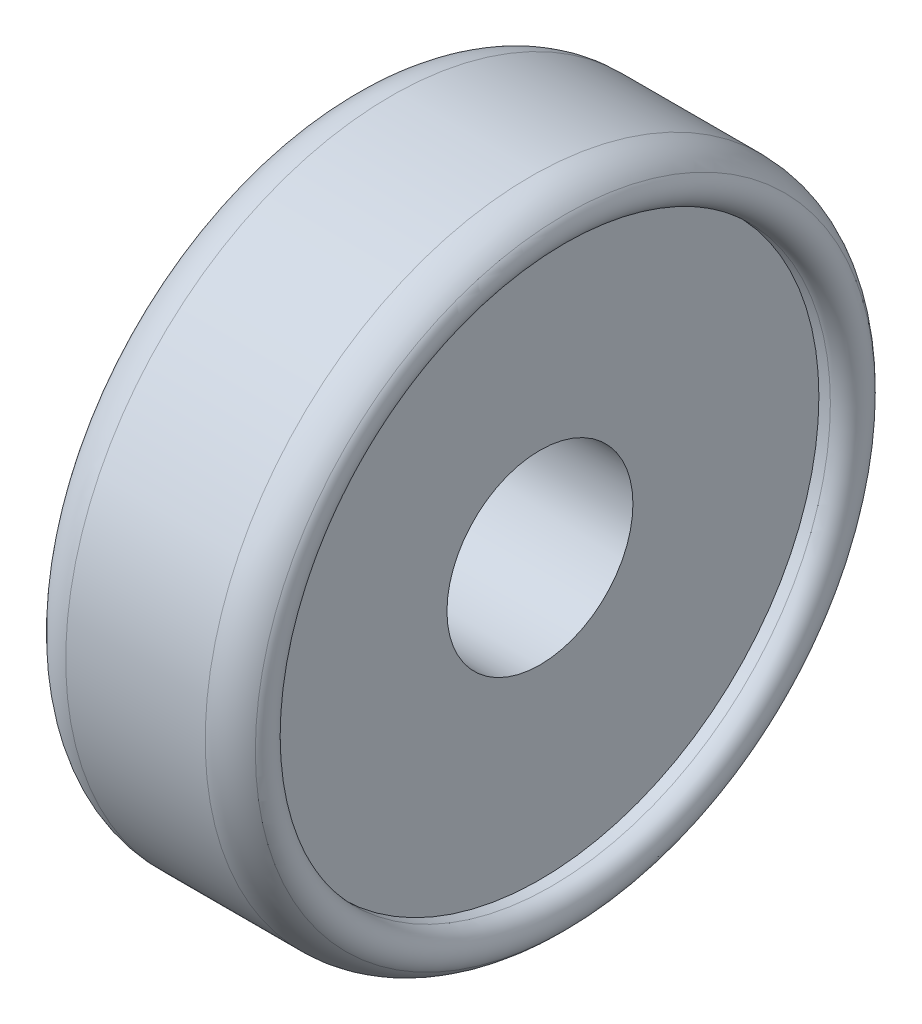
ISO-10303-21;
HEADER;
FILE_DESCRIPTION(('STEP AP214'),'2;1');
FILE_NAME('part.step','',(''),(''),'','','');
FILE_SCHEMA(('AUTOMOTIVE_DESIGN { 1 0 10303 214 1 1 1 1 }'));
ENDSEC;
DATA;
#1=APPLICATION_CONTEXT('core data for automotive mechanical design processes');
#2=APPLICATION_PROTOCOL_DEFINITION('international standard','automotive_design',2000,#1);
#3=PRODUCT_CONTEXT('',#1,'mechanical');
#4=PRODUCT('Part','Part','',(#3));
#5=PRODUCT_RELATED_PRODUCT_CATEGORY('part','',(#4));
#6=PRODUCT_DEFINITION_FORMATION('','',#4);
#7=PRODUCT_DEFINITION_CONTEXT('part definition',#1,'design');
#8=PRODUCT_DEFINITION('design','',#6,#7);
#9=PRODUCT_DEFINITION_SHAPE('','',#8);
#10=(LENGTH_UNIT() NAMED_UNIT(*) SI_UNIT(.MILLI.,.METRE.));
#11=(NAMED_UNIT(*) PLANE_ANGLE_UNIT() SI_UNIT($,.RADIAN.));
#12=(NAMED_UNIT(*) SI_UNIT($,.STERADIAN.) SOLID_ANGLE_UNIT());
#13=UNCERTAINTY_MEASURE_WITH_UNIT(LENGTH_MEASURE(1.E-05),#10,'distance_accuracy_value','');
#14=(GEOMETRIC_REPRESENTATION_CONTEXT(3) GLOBAL_UNCERTAINTY_ASSIGNED_CONTEXT((#13)) GLOBAL_UNIT_ASSIGNED_CONTEXT((#10,
#11,#12)) REPRESENTATION_CONTEXT('',''));
#15=CARTESIAN_POINT('',(0.,0.,0.));
#16=DIRECTION('',(0.,0.,1.));
#17=DIRECTION('',(1.,0.,0.));
#18=AXIS2_PLACEMENT_3D('',#15,#16,#17);
#19=CARTESIAN_POINT('',(125.,0.,0.));
#20=DIRECTION('',(-1.,0.,0.));
#21=DIRECTION('',(0.,0.,1.));
#22=AXIS2_PLACEMENT_3D('',#19,#20,#21);
#23=CYLINDRICAL_SURFACE('',#22,100.);
#24=CARTESIAN_POINT('',(-85.,0.,0.));
#25=DIRECTION('',(-1.,0.,0.));
#26=DIRECTION('',(0.,0.,1.));
#27=AXIS2_PLACEMENT_3D('',#24,#25,#26);
#28=CIRCLE('',#27,100.);
#29=CARTESIAN_POINT('',(-85.,0.,100.));
#30=VERTEX_POINT('',#29);
#31=EDGE_CURVE('E57',#30,#30,#28,.T.);
#32=ORIENTED_EDGE('',*,*,#31,.T.);
#33=EDGE_LOOP('',(#32));
#34=FACE_BOUND('',#33,.T.);
#35=CARTESIAN_POINT('',(85.,0.,0.));
#36=DIRECTION('',(1.,0.,0.));
#37=DIRECTION('',(0.,0.,-1.));
#38=AXIS2_PLACEMENT_3D('',#35,#36,#37);
#39=CIRCLE('',#38,100.);
#40=CARTESIAN_POINT('',(85.,0.,-100.));
#41=VERTEX_POINT('',#40);
#42=EDGE_CURVE('E52',#41,#41,#39,.T.);
#43=ORIENTED_EDGE('',*,*,#42,.T.);
#44=EDGE_LOOP('',(#43));
#45=FACE_BOUND('',#44,.T.);
#46=ADVANCED_FACE('F31',(#34,#45),#23,.F.);
#47=CARTESIAN_POINT('',(125.,0.,0.));
#48=DIRECTION('',(-1.,0.,0.));
#49=DIRECTION('',(0.,0.,1.));
#50=AXIS2_PLACEMENT_3D('',#47,#48,#49);
#51=CYLINDRICAL_SURFACE('',#50,350.);
#52=CARTESIAN_POINT('',(75.,0.,0.));
#53=DIRECTION('',(1.,0.,0.));
#54=DIRECTION('',(0.,0.,-1.));
#55=AXIS2_PLACEMENT_3D('',#52,#53,#54);
#56=CIRCLE('',#55,350.);
#57=CARTESIAN_POINT('',(75.,0.,-350.));
#58=VERTEX_POINT('',#57);
#59=EDGE_CURVE('E51',#58,#58,#56,.F.);
#60=ORIENTED_EDGE('',*,*,#59,.T.);
#61=EDGE_LOOP('',(#60));
#62=FACE_BOUND('',#61,.T.);
#63=CARTESIAN_POINT('',(-75.,0.,0.));
#64=DIRECTION('',(1.,0.,0.));
#65=DIRECTION('',(0.,0.,-1.));
#66=AXIS2_PLACEMENT_3D('',#63,#64,#65);
#67=CIRCLE('',#66,350.);
#68=CARTESIAN_POINT('',(-75.,0.,-350.));
#69=VERTEX_POINT('',#68);
#70=EDGE_CURVE('E60',#69,#69,#67,.T.);
#71=ORIENTED_EDGE('',*,*,#70,.T.);
#72=EDGE_LOOP('',(#71));
#73=FACE_BOUND('',#72,.T.);
#74=ADVANCED_FACE('F88',(#62,#73),#51,.T.);
#75=CARTESIAN_POINT('',(-75.,0.,0.));
#76=DIRECTION('',(1.,0.,0.));
#77=DIRECTION('',(0.,0.,-1.));
#78=AXIS2_PLACEMENT_3D('',#75,#76,#77);
#79=TOROIDAL_SURFACE('',#78,300.,50.);
#80=CARTESIAN_POINT('',(-112.267799624996,0.,0.));
#81=DIRECTION('',(1.,0.,0.));
#82=DIRECTION('',(0.,0.,-1.));
#83=AXIS2_PLACEMENT_3D('',#80,#81,#82);
#84=CIRCLE('',#83,333.333333333333);
#85=CARTESIAN_POINT('',(-112.267799624996,0.,-333.333333333333));
#86=VERTEX_POINT('',#85);
#87=EDGE_CURVE('E10',#86,#86,#84,.T.);
#88=ORIENTED_EDGE('',*,*,#87,.T.);
#89=EDGE_LOOP('',(#88));
#90=FACE_BOUND('',#89,.T.);
#91=ORIENTED_EDGE('',*,*,#70,.F.);
#92=EDGE_LOOP('',(#91));
#93=FACE_BOUND('',#92,.T.);
#94=ADVANCED_FACE('F94',(#90,#93),#79,.T.);
#95=CARTESIAN_POINT('',(75.,0.,0.));
#96=DIRECTION('',(1.,0.,0.));
#97=DIRECTION('',(0.,0.,-1.));
#98=AXIS2_PLACEMENT_3D('',#95,#96,#97);
#99=TOROIDAL_SURFACE('',#98,300.,50.);
#100=CARTESIAN_POINT('',(112.267799624996,0.,0.));
#101=DIRECTION('',(-1.,0.,0.));
#102=DIRECTION('',(0.,0.,1.));
#103=AXIS2_PLACEMENT_3D('',#100,#101,#102);
#104=CIRCLE('',#103,333.333333333332);
#105=CARTESIAN_POINT('',(112.267799624996,0.,333.333333333332));
#106=VERTEX_POINT('',#105);
#107=EDGE_CURVE('E42',#106,#106,#104,.T.);
#108=ORIENTED_EDGE('',*,*,#107,.T.);
#109=EDGE_LOOP('',(#108));
#110=FACE_BOUND('',#109,.T.);
#111=ORIENTED_EDGE('',*,*,#59,.F.);
#112=EDGE_LOOP('',(#111));
#113=FACE_BOUND('',#112,.T.);
#114=ADVANCED_FACE('F102',(#110,#113),#99,.T.);
#115=CARTESIAN_POINT('',(-85.,0.,0.));
#116=DIRECTION('',(-1.,0.,0.));
#117=DIRECTION('',(0.,0.,1.));
#118=AXIS2_PLACEMENT_3D('',#115,#116,#117);
#119=CYLINDRICAL_SURFACE('',#118,300.);
#120=CARTESIAN_POINT('',(-97.3606797749979,0.,0.));
#121=DIRECTION('',(1.,0.,0.));
#122=DIRECTION('',(0.,0.,-1.));
#123=AXIS2_PLACEMENT_3D('',#120,#121,#122);
#124=CIRCLE('',#123,300.);
#125=CARTESIAN_POINT('',(-97.3606797749979,0.,-300.));
#126=VERTEX_POINT('',#125);
#127=EDGE_CURVE('E38',#126,#126,#124,.F.);
#128=ORIENTED_EDGE('',*,*,#127,.T.);
#129=EDGE_LOOP('',(#128));
#130=FACE_BOUND('',#129,.T.);
#131=CARTESIAN_POINT('',(-85.,0.,0.));
#132=DIRECTION('',(-1.,0.,0.));
#133=DIRECTION('',(0.,0.,1.));
#134=AXIS2_PLACEMENT_3D('',#131,#132,#133);
#135=CIRCLE('',#134,300.);
#136=CARTESIAN_POINT('',(-85.,0.,300.));
#137=VERTEX_POINT('',#136);
#138=EDGE_CURVE('E55',#137,#137,#135,.T.);
#139=ORIENTED_EDGE('',*,*,#138,.F.);
#140=EDGE_LOOP('',(#139));
#141=FACE_BOUND('',#140,.T.);
#142=ADVANCED_FACE('F84',(#130,#141),#119,.F.);
#143=CARTESIAN_POINT('',(-85.,0.,0.));
#144=DIRECTION('',(-1.,0.,0.));
#145=DIRECTION('',(0.,0.,1.));
#146=AXIS2_PLACEMENT_3D('',#143,#144,#145);
#147=PLANE('',#146);
#148=ORIENTED_EDGE('',*,*,#31,.F.);
#149=EDGE_LOOP('',(#148));
#150=FACE_BOUND('',#149,.T.);
#151=ORIENTED_EDGE('',*,*,#138,.T.);
#152=EDGE_LOOP('',(#151));
#153=FACE_BOUND('',#152,.T.);
#154=ADVANCED_FACE('F74',(#150,#153),#147,.T.);
#155=CARTESIAN_POINT('',(85.,0.,0.));
#156=DIRECTION('',(1.,0.,0.));
#157=DIRECTION('',(0.,0.,-1.));
#158=AXIS2_PLACEMENT_3D('',#155,#156,#157);
#159=CYLINDRICAL_SURFACE('',#158,300.);
#160=CARTESIAN_POINT('',(97.3606797749979,0.,0.));
#161=DIRECTION('',(-1.,0.,0.));
#162=DIRECTION('',(0.,0.,1.));
#163=AXIS2_PLACEMENT_3D('',#160,#161,#162);
#164=CIRCLE('',#163,300.);
#165=CARTESIAN_POINT('',(97.3606797749979,0.,300.));
#166=VERTEX_POINT('',#165);
#167=EDGE_CURVE('E46',#166,#166,#164,.F.);
#168=ORIENTED_EDGE('',*,*,#167,.T.);
#169=EDGE_LOOP('',(#168));
#170=FACE_BOUND('',#169,.T.);
#171=CARTESIAN_POINT('',(85.,0.,0.));
#172=DIRECTION('',(1.,0.,0.));
#173=DIRECTION('',(0.,0.,-1.));
#174=AXIS2_PLACEMENT_3D('',#171,#172,#173);
#175=CIRCLE('',#174,300.);
#176=CARTESIAN_POINT('',(85.,0.,-300.));
#177=VERTEX_POINT('',#176);
#178=EDGE_CURVE('E56',#177,#177,#175,.T.);
#179=ORIENTED_EDGE('',*,*,#178,.F.);
#180=EDGE_LOOP('',(#179));
#181=FACE_BOUND('',#180,.T.);
#182=ADVANCED_FACE('F72',(#170,#181),#159,.F.);
#183=CARTESIAN_POINT('',(85.,0.,0.));
#184=DIRECTION('',(1.,0.,0.));
#185=DIRECTION('',(0.,0.,-1.));
#186=AXIS2_PLACEMENT_3D('',#183,#184,#185);
#187=PLANE('',#186);
#188=ORIENTED_EDGE('',*,*,#42,.F.);
#189=EDGE_LOOP('',(#188));
#190=FACE_BOUND('',#189,.T.);
#191=ORIENTED_EDGE('',*,*,#178,.T.);
#192=EDGE_LOOP('',(#191));
#193=FACE_BOUND('',#192,.T.);
#194=ADVANCED_FACE('F70',(#190,#193),#187,.T.);
#195=CARTESIAN_POINT('',(97.3606797749979,0.,0.));
#196=DIRECTION('',(-1.,0.,0.));
#197=DIRECTION('',(0.,0.,1.));
#198=AXIS2_PLACEMENT_3D('',#195,#196,#197);
#199=TOROIDAL_SURFACE('',#198,320.,20.);
#200=ORIENTED_EDGE('',*,*,#107,.F.);
#201=EDGE_LOOP('',(#200));
#202=FACE_BOUND('',#201,.T.);
#203=ORIENTED_EDGE('',*,*,#167,.F.);
#204=EDGE_LOOP('',(#203));
#205=FACE_BOUND('',#204,.T.);
#206=ADVANCED_FACE('F81',(#202,#205),#199,.T.);
#207=CARTESIAN_POINT('',(-97.3606797749979,0.,0.));
#208=DIRECTION('',(1.,0.,0.));
#209=DIRECTION('',(0.,0.,-1.));
#210=AXIS2_PLACEMENT_3D('',#207,#208,#209);
#211=TOROIDAL_SURFACE('',#210,320.,20.);
#212=ORIENTED_EDGE('',*,*,#87,.F.);
#213=EDGE_LOOP('',(#212));
#214=FACE_BOUND('',#213,.T.);
#215=ORIENTED_EDGE('',*,*,#127,.F.);
#216=EDGE_LOOP('',(#215));
#217=FACE_BOUND('',#216,.T.);
#218=ADVANCED_FACE('F33',(#214,#217),#211,.T.);
#219=CLOSED_SHELL('',(#46,#74,#94,#114,#142,#154,#182,#194,#206,#218));
#220=MANIFOLD_SOLID_BREP('B2',#219);
#221=ADVANCED_BREP_SHAPE_REPRESENTATION('',(#18,#220),#14);
#222=SHAPE_DEFINITION_REPRESENTATION(#9,#221);
ENDSEC;
END-ISO-10303-21;
